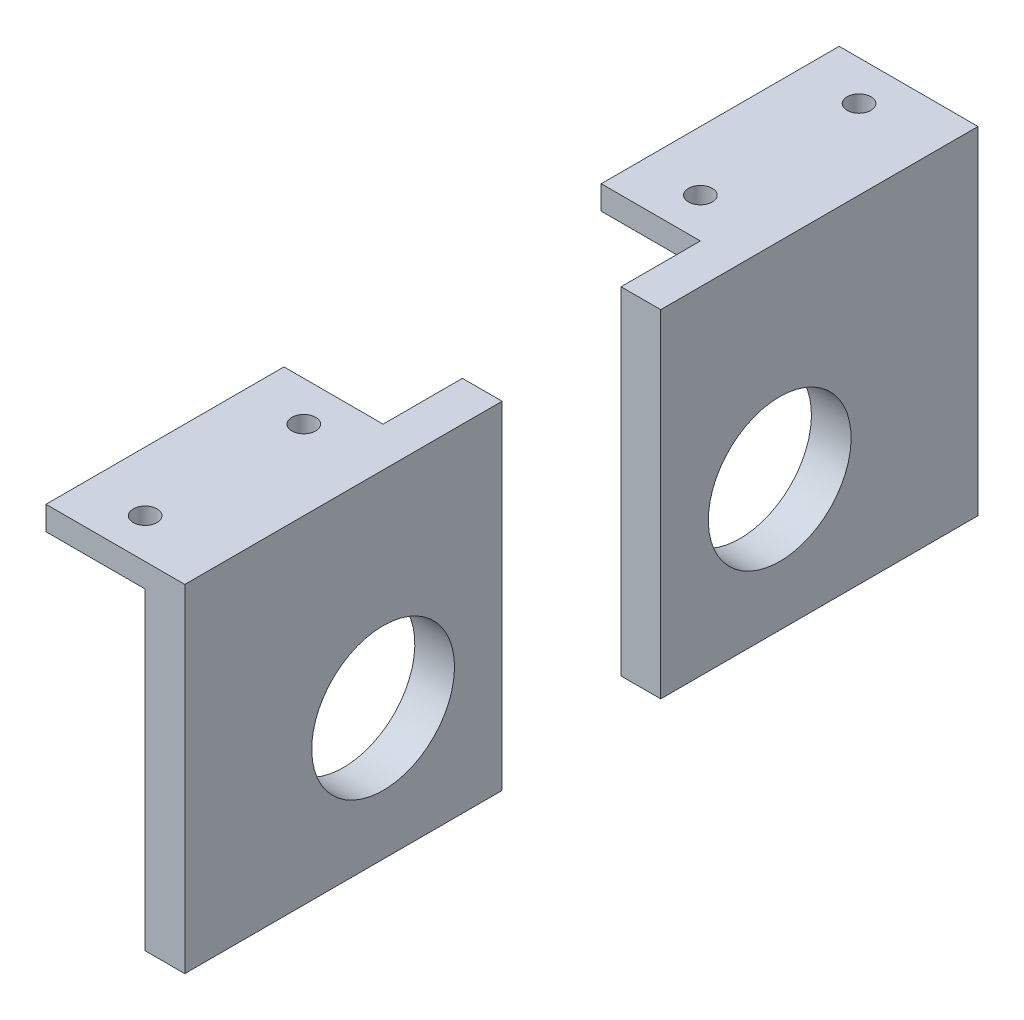
ISO-10303-21;
HEADER;
FILE_DESCRIPTION(('STEP AP214'),'2;1');
FILE_NAME('part.step','',(''),(''),'','','');
FILE_SCHEMA(('AUTOMOTIVE_DESIGN { 1 0 10303 214 1 1 1 1 }'));
ENDSEC;
DATA;
#1=APPLICATION_CONTEXT('core data for automotive mechanical design processes');
#2=APPLICATION_PROTOCOL_DEFINITION('international standard','automotive_design',2000,#1);
#3=PRODUCT_CONTEXT('',#1,'mechanical');
#4=PRODUCT('Part','Part','',(#3));
#5=PRODUCT_RELATED_PRODUCT_CATEGORY('part','',(#4));
#6=PRODUCT_DEFINITION_FORMATION('','',#4);
#7=PRODUCT_DEFINITION_CONTEXT('part definition',#1,'design');
#8=PRODUCT_DEFINITION('design','',#6,#7);
#9=PRODUCT_DEFINITION_SHAPE('','',#8);
#10=(LENGTH_UNIT() NAMED_UNIT(*) SI_UNIT(.MILLI.,.METRE.));
#11=(NAMED_UNIT(*) PLANE_ANGLE_UNIT() SI_UNIT($,.RADIAN.));
#12=(NAMED_UNIT(*) SI_UNIT($,.STERADIAN.) SOLID_ANGLE_UNIT());
#13=UNCERTAINTY_MEASURE_WITH_UNIT(LENGTH_MEASURE(1.E-05),#10,'distance_accuracy_value','');
#14=(GEOMETRIC_REPRESENTATION_CONTEXT(3) GLOBAL_UNCERTAINTY_ASSIGNED_CONTEXT((#13)) GLOBAL_UNIT_ASSIGNED_CONTEXT((#10,
#11,#12)) REPRESENTATION_CONTEXT('',''));
#15=CARTESIAN_POINT('',(0.,0.,0.));
#16=DIRECTION('',(0.,0.,1.));
#17=DIRECTION('',(1.,0.,0.));
#18=AXIS2_PLACEMENT_3D('',#15,#16,#17);
#19=CARTESIAN_POINT('',(5.,-28.5,-85.));
#20=DIRECTION('',(0.,0.,-1.));
#21=DIRECTION('',(1.,0.,0.));
#22=AXIS2_PLACEMENT_3D('',#19,#20,#21);
#23=PLANE('',#22);
#24=DIRECTION('',(0.,1.,0.));
#25=VECTOR('',#24,1.);
#26=CARTESIAN_POINT('',(0.,-28.5,-85.));
#27=LINE('',#26,#25);
#28=CARTESIAN_POINT('',(0.,-28.5,-85.));
#29=VERTEX_POINT('',#28);
#30=CARTESIAN_POINT('',(0.,11.0000000000001,-85.));
#31=VERTEX_POINT('',#30);
#32=EDGE_CURVE('E139',#29,#31,#27,.T.);
#33=ORIENTED_EDGE('',*,*,#32,.T.);
#34=DIRECTION('',(1.,0.,0.));
#35=VECTOR('',#34,1.);
#36=CARTESIAN_POINT('',(5.,11.0000000000001,-85.));
#37=LINE('',#36,#35);
#38=CARTESIAN_POINT('',(-12.5,11.0000000000001,-85.));
#39=VERTEX_POINT('',#38);
#40=EDGE_CURVE('E126',#39,#31,#37,.T.);
#41=ORIENTED_EDGE('',*,*,#40,.F.);
#42=DIRECTION('',(0.,-1.,0.));
#43=VECTOR('',#42,1.);
#44=CARTESIAN_POINT('',(-12.5,14.0000000000001,-85.));
#45=LINE('',#44,#43);
#46=CARTESIAN_POINT('',(-12.5,14.0000000000001,-85.));
#47=VERTEX_POINT('',#46);
#48=EDGE_CURVE('E154',#47,#39,#45,.T.);
#49=ORIENTED_EDGE('',*,*,#48,.F.);
#50=DIRECTION('',(1.,0.,0.));
#51=VECTOR('',#50,1.);
#52=CARTESIAN_POINT('',(5.,14.0000000000001,-85.));
#53=LINE('',#52,#51);
#54=CARTESIAN_POINT('',(5.,14.0000000000001,-85.));
#55=VERTEX_POINT('',#54);
#56=EDGE_CURVE('E152',#47,#55,#53,.T.);
#57=ORIENTED_EDGE('',*,*,#56,.T.);
#58=DIRECTION('',(0.,1.,0.));
#59=VECTOR('',#58,1.);
#60=CARTESIAN_POINT('',(5.,-28.5,-85.));
#61=LINE('',#60,#59);
#62=CARTESIAN_POINT('',(5.,-28.5,-85.));
#63=VERTEX_POINT('',#62);
#64=EDGE_CURVE('E121',#63,#55,#61,.T.);
#65=ORIENTED_EDGE('',*,*,#64,.F.);
#66=DIRECTION('',(-1.,0.,0.));
#67=VECTOR('',#66,1.);
#68=CARTESIAN_POINT('',(5.,-28.5,-85.));
#69=LINE('',#68,#67);
#70=EDGE_CURVE('E12',#63,#29,#69,.T.);
#71=ORIENTED_EDGE('',*,*,#70,.T.);
#72=EDGE_LOOP('',(#33,#41,#49,#57,#65,#71));
#73=FACE_BOUND('',#72,.T.);
#74=ADVANCED_FACE('F51',(#73),#23,.T.);
#75=CARTESIAN_POINT('',(5.,-28.5,-85.));
#76=DIRECTION('',(0.,1.,0.));
#77=DIRECTION('',(0.,0.,-1.));
#78=AXIS2_PLACEMENT_3D('',#75,#76,#77);
#79=PLANE('',#78);
#80=DIRECTION('',(0.,0.,1.));
#81=VECTOR('',#80,1.);
#82=CARTESIAN_POINT('',(0.,-28.5,-85.));
#83=LINE('',#82,#81);
#84=CARTESIAN_POINT('',(0.,-28.5,-45.));
#85=VERTEX_POINT('',#84);
#86=EDGE_CURVE('E135',#29,#85,#83,.T.);
#87=ORIENTED_EDGE('',*,*,#86,.F.);
#88=ORIENTED_EDGE('',*,*,#70,.F.);
#89=DIRECTION('',(0.,0.,1.));
#90=VECTOR('',#89,1.);
#91=CARTESIAN_POINT('',(5.,-28.5,-55.));
#92=LINE('',#91,#90);
#93=CARTESIAN_POINT('',(5.,-28.5,-45.));
#94=VERTEX_POINT('',#93);
#95=EDGE_CURVE('E67',#63,#94,#92,.T.);
#96=ORIENTED_EDGE('',*,*,#95,.T.);
#97=DIRECTION('',(-1.,0.,0.));
#98=VECTOR('',#97,1.);
#99=CARTESIAN_POINT('',(5.,-28.5,-45.));
#100=LINE('',#99,#98);
#101=EDGE_CURVE('E54',#94,#85,#100,.T.);
#102=ORIENTED_EDGE('',*,*,#101,.T.);
#103=EDGE_LOOP('',(#87,#88,#96,#102));
#104=FACE_BOUND('',#103,.T.);
#105=ADVANCED_FACE('F148',(#104),#79,.F.);
#106=CARTESIAN_POINT('',(5.,-28.5,-45.));
#107=DIRECTION('',(0.,0.,-1.));
#108=DIRECTION('',(1.,0.,0.));
#109=AXIS2_PLACEMENT_3D('',#106,#107,#108);
#110=PLANE('',#109);
#111=DIRECTION('',(0.,1.,0.));
#112=VECTOR('',#111,1.);
#113=CARTESIAN_POINT('',(0.,-28.5,-45.));
#114=LINE('',#113,#112);
#115=CARTESIAN_POINT('',(0.,13.9999999999998,-45.));
#116=VERTEX_POINT('',#115);
#117=EDGE_CURVE('E78',#85,#116,#114,.T.);
#118=ORIENTED_EDGE('',*,*,#117,.F.);
#119=ORIENTED_EDGE('',*,*,#101,.F.);
#120=DIRECTION('',(0.,-1.,0.));
#121=VECTOR('',#120,1.);
#122=CARTESIAN_POINT('',(5.,11.,-45.));
#123=LINE('',#122,#121);
#124=CARTESIAN_POINT('',(5.,13.9999999999998,-45.));
#125=VERTEX_POINT('',#124);
#126=EDGE_CURVE('E119',#125,#94,#123,.T.);
#127=ORIENTED_EDGE('',*,*,#126,.F.);
#128=DIRECTION('',(-1.,0.,0.));
#129=VECTOR('',#128,1.);
#130=CARTESIAN_POINT('',(5.,13.9999999999998,-45.));
#131=LINE('',#130,#129);
#132=EDGE_CURVE('E125',#125,#116,#131,.T.);
#133=ORIENTED_EDGE('',*,*,#132,.T.);
#134=EDGE_LOOP('',(#118,#119,#127,#133));
#135=FACE_BOUND('',#134,.T.);
#136=ADVANCED_FACE('F132',(#135),#110,.F.);
#137=CARTESIAN_POINT('',(5.,0.,-70.));
#138=DIRECTION('',(-1.,0.,0.));
#139=DIRECTION('',(0.,0.,-1.));
#140=AXIS2_PLACEMENT_3D('',#137,#138,#139);
#141=PLANE('',#140);
#142=CARTESIAN_POINT('',(5.00000000000006,-12.,-60.));
#143=DIRECTION('',(-1.,0.,0.));
#144=DIRECTION('',(0.,1.,0.));
#145=AXIS2_PLACEMENT_3D('',#142,#143,#144);
#146=CIRCLE('',#145,9.);
#147=CARTESIAN_POINT('',(5.,-2.99999999999997,-60.));
#148=VERTEX_POINT('',#147);
#149=EDGE_CURVE('E173',#148,#148,#146,.T.);
#150=ORIENTED_EDGE('',*,*,#149,.T.);
#151=EDGE_LOOP('',(#150));
#152=FACE_BOUND('',#151,.T.);
#153=ORIENTED_EDGE('',*,*,#64,.T.);
#154=DIRECTION('',(0.,0.,1.));
#155=VECTOR('',#154,1.);
#156=CARTESIAN_POINT('',(5.,13.9999999999999,-55.));
#157=LINE('',#156,#155);
#158=EDGE_CURVE('E115',#55,#125,#157,.T.);
#159=ORIENTED_EDGE('',*,*,#158,.T.);
#160=ORIENTED_EDGE('',*,*,#126,.T.);
#161=ORIENTED_EDGE('',*,*,#95,.F.);
#162=EDGE_LOOP('',(#153,#159,#160,#161));
#163=FACE_BOUND('',#162,.T.);
#164=ADVANCED_FACE('F117',(#152,#163),#141,.F.);
#165=CARTESIAN_POINT('',(0.,0.,-70.));
#166=DIRECTION('',(-1.,0.,0.));
#167=DIRECTION('',(0.,0.,-1.));
#168=AXIS2_PLACEMENT_3D('',#165,#166,#167);
#169=PLANE('',#168);
#170=CARTESIAN_POINT('',(0.,-12.,-60.));
#171=DIRECTION('',(-1.,0.,0.));
#172=DIRECTION('',(0.,1.,0.));
#173=AXIS2_PLACEMENT_3D('',#170,#171,#172);
#174=CIRCLE('',#173,9.);
#175=CARTESIAN_POINT('',(0.,-3.,-60.));
#176=VERTEX_POINT('',#175);
#177=EDGE_CURVE('E142',#176,#176,#174,.T.);
#178=ORIENTED_EDGE('',*,*,#177,.F.);
#179=EDGE_LOOP('',(#178));
#180=FACE_BOUND('',#179,.T.);
#181=ORIENTED_EDGE('',*,*,#32,.F.);
#182=ORIENTED_EDGE('',*,*,#86,.T.);
#183=ORIENTED_EDGE('',*,*,#117,.T.);
#184=DIRECTION('',(0.,0.,-1.));
#185=VECTOR('',#184,1.);
#186=CARTESIAN_POINT('',(0.,13.9999999999998,-45.));
#187=LINE('',#186,#185);
#188=CARTESIAN_POINT('',(0.,13.9999999999999,-55.));
#189=VERTEX_POINT('',#188);
#190=EDGE_CURVE('E130',#116,#189,#187,.T.);
#191=ORIENTED_EDGE('',*,*,#190,.T.);
#192=DIRECTION('',(0.,-1.,0.));
#193=VECTOR('',#192,1.);
#194=CARTESIAN_POINT('',(0.,13.9999999999999,-55.));
#195=LINE('',#194,#193);
#196=CARTESIAN_POINT('',(0.,10.9999999999999,-55.));
#197=VERTEX_POINT('',#196);
#198=EDGE_CURVE('E171',#189,#197,#195,.T.);
#199=ORIENTED_EDGE('',*,*,#198,.T.);
#200=DIRECTION('',(0.,0.,1.));
#201=VECTOR('',#200,1.);
#202=CARTESIAN_POINT('',(0.,11.,-55.));
#203=LINE('',#202,#201);
#204=EDGE_CURVE('E87',#31,#197,#203,.T.);
#205=ORIENTED_EDGE('',*,*,#204,.F.);
#206=EDGE_LOOP('',(#181,#182,#183,#191,#199,#205));
#207=FACE_BOUND('',#206,.T.);
#208=ADVANCED_FACE('F146',(#180,#207),#169,.T.);
#209=CARTESIAN_POINT('',(0.,-12.,-60.));
#210=DIRECTION('',(1.,0.,0.));
#211=DIRECTION('',(0.,1.,0.));
#212=AXIS2_PLACEMENT_3D('',#209,#210,#211);
#213=CYLINDRICAL_SURFACE('',#212,9.);
#214=ORIENTED_EDGE('',*,*,#177,.T.);
#215=EDGE_LOOP('',(#214));
#216=FACE_BOUND('',#215,.T.);
#217=ORIENTED_EDGE('',*,*,#149,.F.);
#218=EDGE_LOOP('',(#217));
#219=FACE_BOUND('',#218,.T.);
#220=ADVANCED_FACE('F179',(#216,#219),#213,.F.);
#221=CARTESIAN_POINT('',(0.,11.,-69.9999999999999));
#222=DIRECTION('',(0.,-1.,0.));
#223=DIRECTION('',(0.,0.,1.));
#224=AXIS2_PLACEMENT_3D('',#221,#222,#223);
#225=PLANE('',#224);
#226=CARTESIAN_POINT('',(-4.99999999999998,10.9999999999999,-60.));
#227=DIRECTION('',(0.,-1.,0.));
#228=DIRECTION('',(0.,0.,-1.));
#229=AXIS2_PLACEMENT_3D('',#226,#227,#228);
#230=CIRCLE('',#229,1.5);
#231=CARTESIAN_POINT('',(-4.99999999999998,10.9999999999999,-61.5));
#232=VERTEX_POINT('',#231);
#233=EDGE_CURVE('E167',#232,#232,#230,.T.);
#234=ORIENTED_EDGE('',*,*,#233,.F.);
#235=EDGE_LOOP('',(#234));
#236=FACE_BOUND('',#235,.T.);
#237=CARTESIAN_POINT('',(-5.00000000000002,11.0000000000001,-80.));
#238=DIRECTION('',(0.,-1.,0.));
#239=DIRECTION('',(0.,0.,-1.));
#240=AXIS2_PLACEMENT_3D('',#237,#238,#239);
#241=CIRCLE('',#240,1.5);
#242=CARTESIAN_POINT('',(-5.00000000000002,11.0000000000002,-81.5));
#243=VERTEX_POINT('',#242);
#244=EDGE_CURVE('E342',#243,#243,#241,.T.);
#245=ORIENTED_EDGE('',*,*,#244,.F.);
#246=EDGE_LOOP('',(#245));
#247=FACE_BOUND('',#246,.T.);
#248=ORIENTED_EDGE('',*,*,#204,.T.);
#249=DIRECTION('',(-1.,0.,0.));
#250=VECTOR('',#249,1.);
#251=CARTESIAN_POINT('',(0.,10.9999999999999,-55.));
#252=LINE('',#251,#250);
#253=CARTESIAN_POINT('',(-12.5,10.9999999999999,-55.));
#254=VERTEX_POINT('',#253);
#255=EDGE_CURVE('E163',#197,#254,#252,.T.);
#256=ORIENTED_EDGE('',*,*,#255,.T.);
#257=DIRECTION('',(0.,0.,-1.));
#258=VECTOR('',#257,1.);
#259=CARTESIAN_POINT('',(-12.5,10.9999999999999,-55.));
#260=LINE('',#259,#258);
#261=EDGE_CURVE('E166',#254,#39,#260,.T.);
#262=ORIENTED_EDGE('',*,*,#261,.T.);
#263=ORIENTED_EDGE('',*,*,#40,.T.);
#264=EDGE_LOOP('',(#248,#256,#262,#263));
#265=FACE_BOUND('',#264,.T.);
#266=ADVANCED_FACE('F181',(#236,#247,#265),#225,.T.);
#267=CARTESIAN_POINT('',(0.,13.9999999999999,-55.));
#268=DIRECTION('',(0.,0.,-1.));
#269=DIRECTION('',(0.,-1.,0.));
#270=AXIS2_PLACEMENT_3D('',#267,#268,#269);
#271=PLANE('',#270);
#272=ORIENTED_EDGE('',*,*,#255,.F.);
#273=ORIENTED_EDGE('',*,*,#198,.F.);
#274=DIRECTION('',(-1.,0.,0.));
#275=VECTOR('',#274,1.);
#276=CARTESIAN_POINT('',(0.,13.9999999999999,-55.));
#277=LINE('',#276,#275);
#278=CARTESIAN_POINT('',(-12.5,13.9999999999999,-55.));
#279=VERTEX_POINT('',#278);
#280=EDGE_CURVE('E159',#189,#279,#277,.T.);
#281=ORIENTED_EDGE('',*,*,#280,.T.);
#282=DIRECTION('',(0.,-1.,0.));
#283=VECTOR('',#282,1.);
#284=CARTESIAN_POINT('',(-12.5,13.9999999999999,-55.));
#285=LINE('',#284,#283);
#286=EDGE_CURVE('E157',#279,#254,#285,.T.);
#287=ORIENTED_EDGE('',*,*,#286,.T.);
#288=EDGE_LOOP('',(#272,#273,#281,#287));
#289=FACE_BOUND('',#288,.T.);
#290=ADVANCED_FACE('F188',(#289),#271,.F.);
#291=CARTESIAN_POINT('',(-12.5,13.9999999999999,-55.));
#292=DIRECTION('',(1.,0.,0.));
#293=DIRECTION('',(0.,0.,1.));
#294=AXIS2_PLACEMENT_3D('',#291,#292,#293);
#295=PLANE('',#294);
#296=ORIENTED_EDGE('',*,*,#261,.F.);
#297=ORIENTED_EDGE('',*,*,#286,.F.);
#298=DIRECTION('',(0.,0.,-1.));
#299=VECTOR('',#298,1.);
#300=CARTESIAN_POINT('',(-12.5,13.9999999999999,-55.));
#301=LINE('',#300,#299);
#302=EDGE_CURVE('E155',#279,#47,#301,.T.);
#303=ORIENTED_EDGE('',*,*,#302,.T.);
#304=ORIENTED_EDGE('',*,*,#48,.T.);
#305=EDGE_LOOP('',(#296,#297,#303,#304));
#306=FACE_BOUND('',#305,.T.);
#307=ADVANCED_FACE('F234',(#306),#295,.F.);
#308=CARTESIAN_POINT('',(0.,14.,-69.9999999999999));
#309=DIRECTION('',(0.,-1.,0.));
#310=DIRECTION('',(0.,0.,1.));
#311=AXIS2_PLACEMENT_3D('',#308,#309,#310);
#312=PLANE('',#311);
#313=CARTESIAN_POINT('',(-4.99999999999998,13.9999999999999,-60.));
#314=DIRECTION('',(0.,-1.,0.));
#315=DIRECTION('',(0.,0.,-1.));
#316=AXIS2_PLACEMENT_3D('',#313,#314,#315);
#317=CIRCLE('',#316,1.5);
#318=CARTESIAN_POINT('',(-4.99999999999998,13.9999999999999,-61.5));
#319=VERTEX_POINT('',#318);
#320=EDGE_CURVE('E337',#319,#319,#317,.T.);
#321=ORIENTED_EDGE('',*,*,#320,.T.);
#322=EDGE_LOOP('',(#321));
#323=FACE_BOUND('',#322,.T.);
#324=CARTESIAN_POINT('',(-5.00000000000002,14.0000000000001,-80.));
#325=DIRECTION('',(0.,-1.,0.));
#326=DIRECTION('',(0.,0.,-1.));
#327=AXIS2_PLACEMENT_3D('',#324,#325,#326);
#328=CIRCLE('',#327,1.5);
#329=CARTESIAN_POINT('',(-5.00000000000002,14.0000000000002,-81.5));
#330=VERTEX_POINT('',#329);
#331=EDGE_CURVE('E338',#330,#330,#328,.T.);
#332=ORIENTED_EDGE('',*,*,#331,.T.);
#333=EDGE_LOOP('',(#332));
#334=FACE_BOUND('',#333,.T.);
#335=ORIENTED_EDGE('',*,*,#158,.F.);
#336=ORIENTED_EDGE('',*,*,#56,.F.);
#337=ORIENTED_EDGE('',*,*,#302,.F.);
#338=ORIENTED_EDGE('',*,*,#280,.F.);
#339=ORIENTED_EDGE('',*,*,#190,.F.);
#340=ORIENTED_EDGE('',*,*,#132,.F.);
#341=EDGE_LOOP('',(#335,#336,#337,#338,#339,#340));
#342=FACE_BOUND('',#341,.T.);
#343=ADVANCED_FACE('F128',(#323,#334,#342),#312,.F.);
#344=CARTESIAN_POINT('',(-5.00000000000002,11.0000000000001,-80.));
#345=DIRECTION('',(0.,1.,0.));
#346=DIRECTION('',(0.,0.,-1.));
#347=AXIS2_PLACEMENT_3D('',#344,#345,#346);
#348=CYLINDRICAL_SURFACE('',#347,1.5);
#349=ORIENTED_EDGE('',*,*,#244,.T.);
#350=EDGE_LOOP('',(#349));
#351=FACE_BOUND('',#350,.T.);
#352=ORIENTED_EDGE('',*,*,#331,.F.);
#353=EDGE_LOOP('',(#352));
#354=FACE_BOUND('',#353,.T.);
#355=ADVANCED_FACE('F254',(#351,#354),#348,.F.);
#356=CARTESIAN_POINT('',(-4.99999999999998,10.9999999999999,-60.));
#357=DIRECTION('',(0.,1.,0.));
#358=DIRECTION('',(0.,0.,-1.));
#359=AXIS2_PLACEMENT_3D('',#356,#357,#358);
#360=CYLINDRICAL_SURFACE('',#359,1.5);
#361=ORIENTED_EDGE('',*,*,#233,.T.);
#362=EDGE_LOOP('',(#361));
#363=FACE_BOUND('',#362,.T.);
#364=ORIENTED_EDGE('',*,*,#320,.F.);
#365=EDGE_LOOP('',(#364));
#366=FACE_BOUND('',#365,.T.);
#367=ADVANCED_FACE('F265',(#363,#366),#360,.F.);
#368=CLOSED_SHELL('',(#74,#105,#136,#164,#208,#220,#266,#290,#307,#343,#355,#367));
#369=MANIFOLD_SOLID_BREP('B2',#368);
#370=CARTESIAN_POINT('',(5.,-28.5,15.));
#371=DIRECTION('',(0.,0.,1.));
#372=DIRECTION('',(1.,0.,0.));
#373=AXIS2_PLACEMENT_3D('',#370,#371,#372);
#374=PLANE('',#373);
#375=DIRECTION('',(0.,1.,0.));
#376=VECTOR('',#375,1.);
#377=CARTESIAN_POINT('',(0.,-28.5,15.));
#378=LINE('',#377,#376);
#379=CARTESIAN_POINT('',(0.,-28.5,15.));
#380=VERTEX_POINT('',#379);
#381=CARTESIAN_POINT('',(0.,11.0000000000001,15.));
#382=VERTEX_POINT('',#381);
#383=EDGE_CURVE('E473',#380,#382,#378,.T.);
#384=ORIENTED_EDGE('',*,*,#383,.F.);
#385=DIRECTION('',(-1.,0.,0.));
#386=VECTOR('',#385,1.);
#387=CARTESIAN_POINT('',(5.,-28.5,15.));
#388=LINE('',#387,#386);
#389=CARTESIAN_POINT('',(5.,-28.5,15.));
#390=VERTEX_POINT('',#389);
#391=EDGE_CURVE('E49',#390,#380,#388,.T.);
#392=ORIENTED_EDGE('',*,*,#391,.F.);
#393=DIRECTION('',(0.,1.,0.));
#394=VECTOR('',#393,1.);
#395=CARTESIAN_POINT('',(5.,-28.5,15.));
#396=LINE('',#395,#394);
#397=CARTESIAN_POINT('',(5.,14.0000000000001,15.));
#398=VERTEX_POINT('',#397);
#399=EDGE_CURVE('E430',#390,#398,#396,.T.);
#400=ORIENTED_EDGE('',*,*,#399,.T.);
#401=DIRECTION('',(1.,0.,0.));
#402=VECTOR('',#401,1.);
#403=CARTESIAN_POINT('',(5.,14.0000000000001,15.));
#404=LINE('',#403,#402);
#405=CARTESIAN_POINT('',(-12.5,14.0000000000001,15.));
#406=VERTEX_POINT('',#405);
#407=EDGE_CURVE('E439',#406,#398,#404,.T.);
#408=ORIENTED_EDGE('',*,*,#407,.F.);
#409=DIRECTION('',(0.,-1.,0.));
#410=VECTOR('',#409,1.);
#411=CARTESIAN_POINT('',(-12.5,14.0000000000001,15.));
#412=LINE('',#411,#410);
#413=CARTESIAN_POINT('',(-12.5,11.0000000000001,15.));
#414=VERTEX_POINT('',#413);
#415=EDGE_CURVE('E455',#406,#414,#412,.T.);
#416=ORIENTED_EDGE('',*,*,#415,.T.);
#417=DIRECTION('',(1.,0.,0.));
#418=VECTOR('',#417,1.);
#419=CARTESIAN_POINT('',(5.,11.0000000000001,15.));
#420=LINE('',#419,#418);
#421=EDGE_CURVE('E440',#414,#382,#420,.T.);
#422=ORIENTED_EDGE('',*,*,#421,.T.);
#423=EDGE_LOOP('',(#384,#392,#400,#408,#416,#422));
#424=FACE_BOUND('',#423,.T.);
#425=ADVANCED_FACE('F361',(#424),#374,.T.);
#426=CARTESIAN_POINT('',(5.,-28.5,15.));
#427=DIRECTION('',(0.,1.,0.));
#428=DIRECTION('',(0.,0.,1.));
#429=AXIS2_PLACEMENT_3D('',#426,#427,#428);
#430=PLANE('',#429);
#431=DIRECTION('',(0.,0.,-1.));
#432=VECTOR('',#431,1.);
#433=CARTESIAN_POINT('',(0.,-28.5,15.));
#434=LINE('',#433,#432);
#435=CARTESIAN_POINT('',(0.,-28.5,-25.));
#436=VERTEX_POINT('',#435);
#437=EDGE_CURVE('E385',#380,#436,#434,.T.);
#438=ORIENTED_EDGE('',*,*,#437,.T.);
#439=DIRECTION('',(-1.,0.,0.));
#440=VECTOR('',#439,1.);
#441=CARTESIAN_POINT('',(5.,-28.5,-25.));
#442=LINE('',#441,#440);
#443=CARTESIAN_POINT('',(5.,-28.5,-25.));
#444=VERTEX_POINT('',#443);
#445=EDGE_CURVE('E364',#444,#436,#442,.T.);
#446=ORIENTED_EDGE('',*,*,#445,.F.);
#447=DIRECTION('',(0.,0.,-1.));
#448=VECTOR('',#447,1.);
#449=CARTESIAN_POINT('',(5.,-28.5,-15.));
#450=LINE('',#449,#448);
#451=EDGE_CURVE('E376',#390,#444,#450,.T.);
#452=ORIENTED_EDGE('',*,*,#451,.F.);
#453=ORIENTED_EDGE('',*,*,#391,.T.);
#454=EDGE_LOOP('',(#438,#446,#452,#453));
#455=FACE_BOUND('',#454,.T.);
#456=ADVANCED_FACE('F509',(#455),#430,.F.);
#457=CARTESIAN_POINT('',(5.,-28.5,-25.));
#458=DIRECTION('',(0.,0.,1.));
#459=DIRECTION('',(1.,0.,0.));
#460=AXIS2_PLACEMENT_3D('',#457,#458,#459);
#461=PLANE('',#460);
#462=DIRECTION('',(0.,1.,0.));
#463=VECTOR('',#462,1.);
#464=CARTESIAN_POINT('',(0.,-28.5,-25.));
#465=LINE('',#464,#463);
#466=CARTESIAN_POINT('',(0.,13.9999999999998,-25.));
#467=VERTEX_POINT('',#466);
#468=EDGE_CURVE('E444',#436,#467,#465,.T.);
#469=ORIENTED_EDGE('',*,*,#468,.T.);
#470=DIRECTION('',(-1.,0.,0.));
#471=VECTOR('',#470,1.);
#472=CARTESIAN_POINT('',(5.,13.9999999999998,-25.));
#473=LINE('',#472,#471);
#474=CARTESIAN_POINT('',(5.,13.9999999999998,-25.));
#475=VERTEX_POINT('',#474);
#476=EDGE_CURVE('E436',#475,#467,#473,.T.);
#477=ORIENTED_EDGE('',*,*,#476,.F.);
#478=DIRECTION('',(0.,-1.,0.));
#479=VECTOR('',#478,1.);
#480=CARTESIAN_POINT('',(5.,11.,-25.));
#481=LINE('',#480,#479);
#482=EDGE_CURVE('E423',#475,#444,#481,.T.);
#483=ORIENTED_EDGE('',*,*,#482,.T.);
#484=ORIENTED_EDGE('',*,*,#445,.T.);
#485=EDGE_LOOP('',(#469,#477,#483,#484));
#486=FACE_BOUND('',#485,.T.);
#487=ADVANCED_FACE('F442',(#486),#461,.F.);
#488=CARTESIAN_POINT('',(5.,0.,0.));
#489=DIRECTION('',(-1.,0.,0.));
#490=DIRECTION('',(0.,0.,1.));
#491=AXIS2_PLACEMENT_3D('',#488,#489,#490);
#492=PLANE('',#491);
#493=CARTESIAN_POINT('',(5.00000000000006,-12.,-10.));
#494=DIRECTION('',(1.,0.,0.));
#495=DIRECTION('',(0.,1.,0.));
#496=AXIS2_PLACEMENT_3D('',#493,#494,#495);
#497=CIRCLE('',#496,9.);
#498=CARTESIAN_POINT('',(5.,-2.99999999999997,-10.));
#499=VERTEX_POINT('',#498);
#500=EDGE_CURVE('E469',#499,#499,#497,.T.);
#501=ORIENTED_EDGE('',*,*,#500,.F.);
#502=EDGE_LOOP('',(#501));
#503=FACE_BOUND('',#502,.T.);
#504=ORIENTED_EDGE('',*,*,#399,.F.);
#505=ORIENTED_EDGE('',*,*,#451,.T.);
#506=ORIENTED_EDGE('',*,*,#482,.F.);
#507=DIRECTION('',(0.,0.,-1.));
#508=VECTOR('',#507,1.);
#509=CARTESIAN_POINT('',(5.,13.9999999999999,-15.));
#510=LINE('',#509,#508);
#511=EDGE_CURVE('E427',#398,#475,#510,.T.);
#512=ORIENTED_EDGE('',*,*,#511,.F.);
#513=EDGE_LOOP('',(#504,#505,#506,#512));
#514=FACE_BOUND('',#513,.T.);
#515=ADVANCED_FACE('F426',(#503,#514),#492,.F.);
#516=CARTESIAN_POINT('',(0.,0.,0.));
#517=DIRECTION('',(-1.,0.,0.));
#518=DIRECTION('',(0.,0.,1.));
#519=AXIS2_PLACEMENT_3D('',#516,#517,#518);
#520=PLANE('',#519);
#521=CARTESIAN_POINT('',(0.,-12.,-10.));
#522=DIRECTION('',(1.,0.,0.));
#523=DIRECTION('',(0.,1.,0.));
#524=AXIS2_PLACEMENT_3D('',#521,#522,#523);
#525=CIRCLE('',#524,9.);
#526=CARTESIAN_POINT('',(0.,-3.,-10.));
#527=VERTEX_POINT('',#526);
#528=EDGE_CURVE('E470',#527,#527,#525,.T.);
#529=ORIENTED_EDGE('',*,*,#528,.T.);
#530=EDGE_LOOP('',(#529));
#531=FACE_BOUND('',#530,.T.);
#532=ORIENTED_EDGE('',*,*,#383,.T.);
#533=DIRECTION('',(0.,0.,-1.));
#534=VECTOR('',#533,1.);
#535=CARTESIAN_POINT('',(0.,11.,-15.));
#536=LINE('',#535,#534);
#537=CARTESIAN_POINT('',(0.,10.9999999999999,-15.));
#538=VERTEX_POINT('',#537);
#539=EDGE_CURVE('E393',#382,#538,#536,.T.);
#540=ORIENTED_EDGE('',*,*,#539,.T.);
#541=DIRECTION('',(0.,-1.,0.));
#542=VECTOR('',#541,1.);
#543=CARTESIAN_POINT('',(0.,13.9999999999999,-15.));
#544=LINE('',#543,#542);
#545=CARTESIAN_POINT('',(0.,13.9999999999999,-15.));
#546=VERTEX_POINT('',#545);
#547=EDGE_CURVE('E467',#546,#538,#544,.T.);
#548=ORIENTED_EDGE('',*,*,#547,.F.);
#549=DIRECTION('',(0.,0.,1.));
#550=VECTOR('',#549,1.);
#551=CARTESIAN_POINT('',(0.,13.9999999999998,-25.));
#552=LINE('',#551,#550);
#553=EDGE_CURVE('E445',#467,#546,#552,.T.);
#554=ORIENTED_EDGE('',*,*,#553,.F.);
#555=ORIENTED_EDGE('',*,*,#468,.F.);
#556=ORIENTED_EDGE('',*,*,#437,.F.);
#557=EDGE_LOOP('',(#532,#540,#548,#554,#555,#556));
#558=FACE_BOUND('',#557,.T.);
#559=ADVANCED_FACE('F484',(#531,#558),#520,.T.);
#560=CARTESIAN_POINT('',(0.,-12.,-10.));
#561=DIRECTION('',(1.,0.,0.));
#562=DIRECTION('',(0.,1.,0.));
#563=AXIS2_PLACEMENT_3D('',#560,#561,#562);
#564=CYLINDRICAL_SURFACE('',#563,9.);
#565=ORIENTED_EDGE('',*,*,#528,.F.);
#566=EDGE_LOOP('',(#565));
#567=FACE_BOUND('',#566,.T.);
#568=ORIENTED_EDGE('',*,*,#500,.T.);
#569=EDGE_LOOP('',(#568));
#570=FACE_BOUND('',#569,.T.);
#571=ADVANCED_FACE('F504',(#567,#570),#564,.F.);
#572=CARTESIAN_POINT('',(0.,11.,0.));
#573=DIRECTION('',(0.,-1.,0.));
#574=DIRECTION('',(0.,0.,-1.));
#575=AXIS2_PLACEMENT_3D('',#572,#573,#574);
#576=PLANE('',#575);
#577=CARTESIAN_POINT('',(-4.99999999999998,10.9999999999999,-9.99999999999998));
#578=DIRECTION('',(0.,1.,0.));
#579=DIRECTION('',(0.,0.,1.));
#580=AXIS2_PLACEMENT_3D('',#577,#578,#579);
#581=CIRCLE('',#580,1.5);
#582=CARTESIAN_POINT('',(-4.99999999999998,10.9999999999999,-8.49999999999998));
#583=VERTEX_POINT('',#582);
#584=EDGE_CURVE('E459',#583,#583,#581,.T.);
#585=ORIENTED_EDGE('',*,*,#584,.T.);
#586=EDGE_LOOP('',(#585));
#587=FACE_BOUND('',#586,.T.);
#588=CARTESIAN_POINT('',(-5.00000000000002,11.0000000000001,10.));
#589=DIRECTION('',(0.,1.,0.));
#590=DIRECTION('',(0.,0.,1.));
#591=AXIS2_PLACEMENT_3D('',#588,#589,#590);
#592=CIRCLE('',#591,1.5);
#593=CARTESIAN_POINT('',(-5.00000000000002,11.0000000000002,11.5));
#594=VERTEX_POINT('',#593);
#595=EDGE_CURVE('E659',#594,#594,#592,.T.);
#596=ORIENTED_EDGE('',*,*,#595,.T.);
#597=EDGE_LOOP('',(#596));
#598=FACE_BOUND('',#597,.T.);
#599=ORIENTED_EDGE('',*,*,#539,.F.);
#600=ORIENTED_EDGE('',*,*,#421,.F.);
#601=DIRECTION('',(0.,0.,1.));
#602=VECTOR('',#601,1.);
#603=CARTESIAN_POINT('',(-12.5,10.9999999999999,-15.));
#604=LINE('',#603,#602);
#605=CARTESIAN_POINT('',(-12.5,10.9999999999999,-15.));
#606=VERTEX_POINT('',#605);
#607=EDGE_CURVE('E458',#606,#414,#604,.T.);
#608=ORIENTED_EDGE('',*,*,#607,.F.);
#609=DIRECTION('',(-1.,0.,0.));
#610=VECTOR('',#609,1.);
#611=CARTESIAN_POINT('',(0.,10.9999999999999,-15.));
#612=LINE('',#611,#610);
#613=EDGE_CURVE('E456',#538,#606,#612,.T.);
#614=ORIENTED_EDGE('',*,*,#613,.F.);
#615=EDGE_LOOP('',(#599,#600,#608,#614));
#616=FACE_BOUND('',#615,.T.);
#617=ADVANCED_FACE('F490',(#587,#598,#616),#576,.T.);
#618=CARTESIAN_POINT('',(0.,13.9999999999999,-15.));
#619=DIRECTION('',(0.,0.,1.));
#620=DIRECTION('',(0.,-1.,0.));
#621=AXIS2_PLACEMENT_3D('',#618,#619,#620);
#622=PLANE('',#621);
#623=ORIENTED_EDGE('',*,*,#613,.T.);
#624=DIRECTION('',(0.,-1.,0.));
#625=VECTOR('',#624,1.);
#626=CARTESIAN_POINT('',(-12.5,13.9999999999999,-15.));
#627=LINE('',#626,#625);
#628=CARTESIAN_POINT('',(-12.5,13.9999999999999,-15.));
#629=VERTEX_POINT('',#628);
#630=EDGE_CURVE('E464',#629,#606,#627,.T.);
#631=ORIENTED_EDGE('',*,*,#630,.F.);
#632=DIRECTION('',(-1.,0.,0.));
#633=VECTOR('',#632,1.);
#634=CARTESIAN_POINT('',(0.,13.9999999999999,-15.));
#635=LINE('',#634,#633);
#636=EDGE_CURVE('E447',#546,#629,#635,.T.);
#637=ORIENTED_EDGE('',*,*,#636,.F.);
#638=ORIENTED_EDGE('',*,*,#547,.T.);
#639=EDGE_LOOP('',(#623,#631,#637,#638));
#640=FACE_BOUND('',#639,.T.);
#641=ADVANCED_FACE('F496',(#640),#622,.F.);
#642=CARTESIAN_POINT('',(-12.5,13.9999999999999,-15.));
#643=DIRECTION('',(1.,0.,0.));
#644=DIRECTION('',(0.,0.,-1.));
#645=AXIS2_PLACEMENT_3D('',#642,#643,#644);
#646=PLANE('',#645);
#647=ORIENTED_EDGE('',*,*,#607,.T.);
#648=ORIENTED_EDGE('',*,*,#415,.F.);
#649=DIRECTION('',(0.,0.,1.));
#650=VECTOR('',#649,1.);
#651=CARTESIAN_POINT('',(-12.5,13.9999999999999,-15.));
#652=LINE('',#651,#650);
#653=EDGE_CURVE('E452',#629,#406,#652,.T.);
#654=ORIENTED_EDGE('',*,*,#653,.F.);
#655=ORIENTED_EDGE('',*,*,#630,.T.);
#656=EDGE_LOOP('',(#647,#648,#654,#655));
#657=FACE_BOUND('',#656,.T.);
#658=ADVANCED_FACE('F492',(#657),#646,.F.);
#659=CARTESIAN_POINT('',(0.,14.,0.));
#660=DIRECTION('',(0.,-1.,0.));
#661=DIRECTION('',(0.,0.,-1.));
#662=AXIS2_PLACEMENT_3D('',#659,#660,#661);
#663=PLANE('',#662);
#664=CARTESIAN_POINT('',(-4.99999999999998,13.9999999999999,-10.));
#665=DIRECTION('',(0.,1.,0.));
#666=DIRECTION('',(0.,0.,1.));
#667=AXIS2_PLACEMENT_3D('',#664,#665,#666);
#668=CIRCLE('',#667,1.5);
#669=CARTESIAN_POINT('',(-4.99999999999998,13.9999999999999,-8.50000000000002));
#670=VERTEX_POINT('',#669);
#671=EDGE_CURVE('E654',#670,#670,#668,.T.);
#672=ORIENTED_EDGE('',*,*,#671,.F.);
#673=EDGE_LOOP('',(#672));
#674=FACE_BOUND('',#673,.T.);
#675=CARTESIAN_POINT('',(-5.00000000000002,14.0000000000001,9.99999999999998));
#676=DIRECTION('',(0.,1.,0.));
#677=DIRECTION('',(0.,0.,1.));
#678=AXIS2_PLACEMENT_3D('',#675,#676,#677);
#679=CIRCLE('',#678,1.5);
#680=CARTESIAN_POINT('',(-5.00000000000002,14.0000000000002,11.5));
#681=VERTEX_POINT('',#680);
#682=EDGE_CURVE('E655',#681,#681,#679,.T.);
#683=ORIENTED_EDGE('',*,*,#682,.F.);
#684=EDGE_LOOP('',(#683));
#685=FACE_BOUND('',#684,.T.);
#686=ORIENTED_EDGE('',*,*,#511,.T.);
#687=ORIENTED_EDGE('',*,*,#476,.T.);
#688=ORIENTED_EDGE('',*,*,#553,.T.);
#689=ORIENTED_EDGE('',*,*,#636,.T.);
#690=ORIENTED_EDGE('',*,*,#653,.T.);
#691=ORIENTED_EDGE('',*,*,#407,.T.);
#692=EDGE_LOOP('',(#686,#687,#688,#689,#690,#691));
#693=FACE_BOUND('',#692,.T.);
#694=ADVANCED_FACE('F435',(#674,#685,#693),#663,.F.);
#695=CARTESIAN_POINT('',(-5.00000000000002,11.0000000000001,10.));
#696=DIRECTION('',(0.,1.,0.));
#697=DIRECTION('',(0.,0.,1.));
#698=AXIS2_PLACEMENT_3D('',#695,#696,#697);
#699=CYLINDRICAL_SURFACE('',#698,1.5);
#700=ORIENTED_EDGE('',*,*,#595,.F.);
#701=EDGE_LOOP('',(#700));
#702=FACE_BOUND('',#701,.T.);
#703=ORIENTED_EDGE('',*,*,#682,.T.);
#704=EDGE_LOOP('',(#703));
#705=FACE_BOUND('',#704,.T.);
#706=ADVANCED_FACE('F551',(#702,#705),#699,.F.);
#707=CARTESIAN_POINT('',(-4.99999999999998,10.9999999999999,-9.99999999999998));
#708=DIRECTION('',(0.,1.,0.));
#709=DIRECTION('',(0.,0.,1.));
#710=AXIS2_PLACEMENT_3D('',#707,#708,#709);
#711=CYLINDRICAL_SURFACE('',#710,1.5);
#712=ORIENTED_EDGE('',*,*,#584,.F.);
#713=EDGE_LOOP('',(#712));
#714=FACE_BOUND('',#713,.T.);
#715=ORIENTED_EDGE('',*,*,#671,.T.);
#716=EDGE_LOOP('',(#715));
#717=FACE_BOUND('',#716,.T.);
#718=ADVANCED_FACE('F562',(#714,#717),#711,.F.);
#719=CLOSED_SHELL('',(#425,#456,#487,#515,#559,#571,#617,#641,#658,#694,#706,#718));
#720=MANIFOLD_SOLID_BREP('B6',#719);
#721=ADVANCED_BREP_SHAPE_REPRESENTATION('',(#18,#369,#720),#14);
#722=SHAPE_DEFINITION_REPRESENTATION(#9,#721);
ENDSEC;
END-ISO-10303-21;
